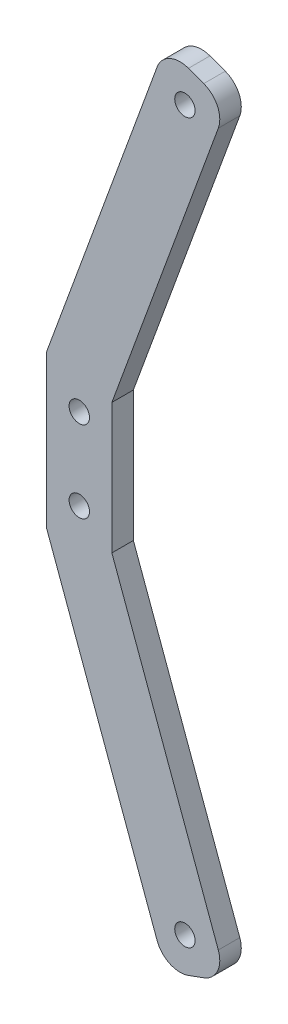
ISO-10303-21;
HEADER;
FILE_DESCRIPTION(('STEP AP214'),'2;1');
FILE_NAME('part.step','',(''),(''),'','','');
FILE_SCHEMA(('AUTOMOTIVE_DESIGN { 1 0 10303 214 1 1 1 1 }'));
ENDSEC;
DATA;
#1=APPLICATION_CONTEXT('core data for automotive mechanical design processes');
#2=APPLICATION_PROTOCOL_DEFINITION('international standard','automotive_design',2000,#1);
#3=PRODUCT_CONTEXT('',#1,'mechanical');
#4=PRODUCT('Part','Part','',(#3));
#5=PRODUCT_RELATED_PRODUCT_CATEGORY('part','',(#4));
#6=PRODUCT_DEFINITION_FORMATION('','',#4);
#7=PRODUCT_DEFINITION_CONTEXT('part definition',#1,'design');
#8=PRODUCT_DEFINITION('design','',#6,#7);
#9=PRODUCT_DEFINITION_SHAPE('','',#8);
#10=(LENGTH_UNIT() NAMED_UNIT(*) SI_UNIT(.MILLI.,.METRE.));
#11=(NAMED_UNIT(*) PLANE_ANGLE_UNIT() SI_UNIT($,.RADIAN.));
#12=(NAMED_UNIT(*) SI_UNIT($,.STERADIAN.) SOLID_ANGLE_UNIT());
#13=UNCERTAINTY_MEASURE_WITH_UNIT(LENGTH_MEASURE(1.E-05),#10,'distance_accuracy_value','');
#14=(GEOMETRIC_REPRESENTATION_CONTEXT(3) GLOBAL_UNCERTAINTY_ASSIGNED_CONTEXT((#13)) GLOBAL_UNIT_ASSIGNED_CONTEXT((#10,
#11,#12)) REPRESENTATION_CONTEXT('',''));
#15=CARTESIAN_POINT('',(0.,0.,0.));
#16=DIRECTION('',(0.,0.,1.));
#17=DIRECTION('',(1.,0.,0.));
#18=AXIS2_PLACEMENT_3D('',#15,#16,#17);
#19=CARTESIAN_POINT('',(0.,0.,8.382));
#20=DIRECTION('',(0.,0.,-1.));
#21=DIRECTION('',(-1.,0.,0.));
#22=AXIS2_PLACEMENT_3D('',#19,#20,#21);
#23=PLANE('',#22);
#24=CARTESIAN_POINT('',(12.7,15.875,8.382));
#25=DIRECTION('',(0.,0.,-1.));
#26=DIRECTION('',(-1.,0.,0.));
#27=AXIS2_PLACEMENT_3D('',#24,#25,#26);
#28=CIRCLE('',#27,3.96875);
#29=CARTESIAN_POINT('',(8.73125,15.875,8.382));
#30=VERTEX_POINT('',#29);
#31=EDGE_CURVE('E146',#30,#30,#28,.T.);
#32=ORIENTED_EDGE('',*,*,#31,.T.);
#33=EDGE_LOOP('',(#32));
#34=FACE_BOUND('',#33,.T.);
#35=CARTESIAN_POINT('',(53.8649414209173,140.079609063267,8.382));
#36=DIRECTION('',(0.,0.,-1.));
#37=DIRECTION('',(-1.,0.,0.));
#38=AXIS2_PLACEMENT_3D('',#35,#36,#37);
#39=CIRCLE('',#38,3.96874999999998);
#40=CARTESIAN_POINT('',(49.8961914209173,140.079609063267,8.382));
#41=VERTEX_POINT('',#40);
#42=EDGE_CURVE('E156',#41,#41,#39,.T.);
#43=ORIENTED_EDGE('',*,*,#42,.T.);
#44=EDGE_LOOP('',(#43));
#45=FACE_BOUND('',#44,.T.);
#46=DIRECTION('',(-0.939034257860021,-0.343823592217404,0.));
#47=VECTOR('',#46,1.);
#48=CARTESIAN_POINT('',(46.3057659672561,-156.37190375925,8.382));
#49=LINE('',#48,#47);
#50=CARTESIAN_POINT('',(61.2129348107839,-150.913704232799,8.382));
#51=VERTEX_POINT('',#50);
#52=CARTESIAN_POINT('',(55.2500672733727,-153.09698404338,8.382));
#53=VERTEX_POINT('',#52);
#54=EDGE_CURVE('E125',#51,#53,#49,.T.);
#55=ORIENTED_EDGE('',*,*,#54,.F.);
#56=CARTESIAN_POINT('',(57.9380150949131,-141.969402926682,8.382));
#57=DIRECTION('',(0.,0.,-1.));
#58=DIRECTION('',(-1.,0.,0.));
#59=AXIS2_PLACEMENT_3D('',#56,#57,#58);
#60=CIRCLE('',#59,9.525);
#61=CARTESIAN_POINT('',(66.8823164010298,-138.694483210812,8.382));
#62=VERTEX_POINT('',#61);
#63=EDGE_CURVE('E41',#51,#62,#60,.F.);
#64=ORIENTED_EDGE('',*,*,#63,.T.);
#65=DIRECTION('',(0.343823592217404,-0.939034257860021,0.));
#66=VECTOR('',#65,1.);
#67=CARTESIAN_POINT('',(70.1572361169006,-147.638784516928,8.382));
#68=LINE('',#67,#66);
#69=CARTESIAN_POINT('',(25.4,-25.4,8.382));
#70=VERTEX_POINT('',#69);
#71=EDGE_CURVE('E149',#70,#62,#68,.T.);
#72=ORIENTED_EDGE('',*,*,#71,.F.);
#73=DIRECTION('',(0.,1.,0.));
#74=VECTOR('',#73,1.);
#75=CARTESIAN_POINT('',(25.4,25.4,8.382));
#76=LINE('',#75,#74);
#77=CARTESIAN_POINT('',(25.4,25.4,8.382));
#78=VERTEX_POINT('',#77);
#79=EDGE_CURVE('E162',#70,#78,#76,.T.);
#80=ORIENTED_EDGE('',*,*,#79,.T.);
#81=DIRECTION('',(0.343823592217404,0.939034257860021,0.));
#82=VECTOR('',#81,1.);
#83=CARTESIAN_POINT('',(70.1572361169006,147.638784516928,8.382));
#84=LINE('',#83,#82);
#85=CARTESIAN_POINT('',(66.8823164010298,138.694483210812,8.382));
#86=VERTEX_POINT('',#85);
#87=EDGE_CURVE('E164',#78,#86,#84,.T.);
#88=ORIENTED_EDGE('',*,*,#87,.T.);
#89=CARTESIAN_POINT('',(57.9380150949131,141.969402926682,8.382));
#90=DIRECTION('',(0.,0.,-1.));
#91=DIRECTION('',(-1.,0.,0.));
#92=AXIS2_PLACEMENT_3D('',#89,#90,#91);
#93=CIRCLE('',#92,9.525);
#94=CARTESIAN_POINT('',(61.2129348107839,150.913704232799,8.382));
#95=VERTEX_POINT('',#94);
#96=EDGE_CURVE('E198',#86,#95,#93,.F.);
#97=ORIENTED_EDGE('',*,*,#96,.T.);
#98=DIRECTION('',(-0.939034257860021,0.343823592217404,0.));
#99=VECTOR('',#98,1.);
#100=CARTESIAN_POINT('',(46.3057659672561,156.37190375925,8.382));
#101=LINE('',#100,#99);
#102=CARTESIAN_POINT('',(55.2500672733727,153.09698404338,8.382));
#103=VERTEX_POINT('',#102);
#104=EDGE_CURVE('E167',#95,#103,#101,.T.);
#105=ORIENTED_EDGE('',*,*,#104,.T.);
#106=CARTESIAN_POINT('',(51.975147557502,144.152682737263,8.382));
#107=DIRECTION('',(0.,0.,-1.));
#108=DIRECTION('',(-1.,0.,0.));
#109=AXIS2_PLACEMENT_3D('',#106,#107,#108);
#110=CIRCLE('',#109,9.525);
#111=CARTESIAN_POINT('',(43.0308462513853,147.427602453134,8.382));
#112=VERTEX_POINT('',#111);
#113=EDGE_CURVE('E196',#103,#112,#110,.F.);
#114=ORIENTED_EDGE('',*,*,#113,.T.);
#115=DIRECTION('',(-0.343823592217404,-0.939034257860021,0.));
#116=VECTOR('',#115,1.);
#117=CARTESIAN_POINT('',(0.,29.9038498968864,8.382));
#118=LINE('',#117,#116);
#119=CARTESIAN_POINT('',(0.,29.9038498968864,8.382));
#120=VERTEX_POINT('',#119);
#121=EDGE_CURVE('E132',#112,#120,#118,.T.);
#122=ORIENTED_EDGE('',*,*,#121,.T.);
#123=DIRECTION('',(0.,-1.,0.));
#124=VECTOR('',#123,1.);
#125=CARTESIAN_POINT('',(0.,0.,8.382));
#126=LINE('',#125,#124);
#127=CARTESIAN_POINT('',(0.,-29.9038498968864,8.382));
#128=VERTEX_POINT('',#127);
#129=EDGE_CURVE('E129',#120,#128,#126,.T.);
#130=ORIENTED_EDGE('',*,*,#129,.T.);
#131=DIRECTION('',(-0.343823592217404,0.939034257860021,0.));
#132=VECTOR('',#131,1.);
#133=CARTESIAN_POINT('',(0.,-29.9038498968864,8.382));
#134=LINE('',#133,#132);
#135=CARTESIAN_POINT('',(43.0308462513853,-147.427602453134,8.382));
#136=VERTEX_POINT('',#135);
#137=EDGE_CURVE('E120',#136,#128,#134,.T.);
#138=ORIENTED_EDGE('',*,*,#137,.F.);
#139=CARTESIAN_POINT('',(51.975147557502,-144.152682737263,8.382));
#140=DIRECTION('',(0.,0.,-1.));
#141=DIRECTION('',(-1.,0.,0.));
#142=AXIS2_PLACEMENT_3D('',#139,#140,#141);
#143=CIRCLE('',#142,9.525);
#144=EDGE_CURVE('E53',#136,#53,#143,.F.);
#145=ORIENTED_EDGE('',*,*,#144,.T.);
#146=EDGE_LOOP('',(#55,#64,#72,#80,#88,#97,#105,#114,#122,#130,#138,#145));
#147=FACE_BOUND('',#146,.T.);
#148=CARTESIAN_POINT('',(53.8649414209173,-140.079609063267,8.382));
#149=DIRECTION('',(0.,0.,1.));
#150=DIRECTION('',(-1.,0.,0.));
#151=AXIS2_PLACEMENT_3D('',#148,#149,#150);
#152=CIRCLE('',#151,3.96874999999998);
#153=CARTESIAN_POINT('',(49.8961914209173,-140.079609063267,8.382));
#154=VERTEX_POINT('',#153);
#155=EDGE_CURVE('E239',#154,#154,#152,.T.);
#156=ORIENTED_EDGE('',*,*,#155,.F.);
#157=EDGE_LOOP('',(#156));
#158=FACE_BOUND('',#157,.T.);
#159=CARTESIAN_POINT('',(12.7,-15.875,8.382));
#160=DIRECTION('',(0.,0.,1.));
#161=DIRECTION('',(-1.,0.,0.));
#162=AXIS2_PLACEMENT_3D('',#159,#160,#161);
#163=CIRCLE('',#162,3.96875);
#164=CARTESIAN_POINT('',(8.73125,-15.875,8.382));
#165=VERTEX_POINT('',#164);
#166=EDGE_CURVE('E246',#165,#165,#163,.T.);
#167=ORIENTED_EDGE('',*,*,#166,.F.);
#168=EDGE_LOOP('',(#167));
#169=FACE_BOUND('',#168,.T.);
#170=ADVANCED_FACE('F33',(#34,#45,#147,#158,#169),#23,.F.);
#171=CARTESIAN_POINT('',(0.,0.,0.));
#172=DIRECTION('',(0.,0.,-1.));
#173=DIRECTION('',(-1.,0.,0.));
#174=AXIS2_PLACEMENT_3D('',#171,#172,#173);
#175=PLANE('',#174);
#176=CARTESIAN_POINT('',(53.8649414209173,-140.079609063267,0.));
#177=DIRECTION('',(0.,0.,1.));
#178=DIRECTION('',(-1.,0.,0.));
#179=AXIS2_PLACEMENT_3D('',#176,#177,#178);
#180=CIRCLE('',#179,3.96874999999998);
#181=CARTESIAN_POINT('',(49.8961914209173,-140.079609063267,0.));
#182=VERTEX_POINT('',#181);
#183=EDGE_CURVE('E243',#182,#182,#180,.T.);
#184=ORIENTED_EDGE('',*,*,#183,.T.);
#185=EDGE_LOOP('',(#184));
#186=FACE_BOUND('',#185,.T.);
#187=CARTESIAN_POINT('',(12.7,15.875,0.));
#188=DIRECTION('',(0.,0.,-1.));
#189=DIRECTION('',(-1.,0.,0.));
#190=AXIS2_PLACEMENT_3D('',#187,#188,#189);
#191=CIRCLE('',#190,3.96875);
#192=CARTESIAN_POINT('',(8.73125,15.875,0.));
#193=VERTEX_POINT('',#192);
#194=EDGE_CURVE('E142',#193,#193,#191,.T.);
#195=ORIENTED_EDGE('',*,*,#194,.F.);
#196=EDGE_LOOP('',(#195));
#197=FACE_BOUND('',#196,.T.);
#198=CARTESIAN_POINT('',(53.8649414209173,140.079609063267,0.));
#199=DIRECTION('',(0.,0.,-1.));
#200=DIRECTION('',(-1.,0.,0.));
#201=AXIS2_PLACEMENT_3D('',#198,#199,#200);
#202=CIRCLE('',#201,3.96874999999998);
#203=CARTESIAN_POINT('',(49.8961914209173,140.079609063267,0.));
#204=VERTEX_POINT('',#203);
#205=EDGE_CURVE('E154',#204,#204,#202,.T.);
#206=ORIENTED_EDGE('',*,*,#205,.F.);
#207=EDGE_LOOP('',(#206));
#208=FACE_BOUND('',#207,.T.);
#209=DIRECTION('',(0.343823592217404,-0.939034257860021,0.));
#210=VECTOR('',#209,1.);
#211=CARTESIAN_POINT('',(70.1572361169006,-147.638784516928,0.));
#212=LINE('',#211,#210);
#213=CARTESIAN_POINT('',(25.4,-25.4,0.));
#214=VERTEX_POINT('',#213);
#215=CARTESIAN_POINT('',(66.8823164010298,-138.694483210812,0.));
#216=VERTEX_POINT('',#215);
#217=EDGE_CURVE('E126',#214,#216,#212,.T.);
#218=ORIENTED_EDGE('',*,*,#217,.T.);
#219=CARTESIAN_POINT('',(57.9380150949131,-141.969402926682,0.));
#220=DIRECTION('',(0.,0.,-1.));
#221=DIRECTION('',(-1.,0.,0.));
#222=AXIS2_PLACEMENT_3D('',#219,#220,#221);
#223=CIRCLE('',#222,9.525);
#224=CARTESIAN_POINT('',(61.2129348107839,-150.913704232799,0.));
#225=VERTEX_POINT('',#224);
#226=EDGE_CURVE('E208',#216,#225,#223,.T.);
#227=ORIENTED_EDGE('',*,*,#226,.T.);
#228=DIRECTION('',(-0.939034257860021,-0.343823592217404,0.));
#229=VECTOR('',#228,1.);
#230=CARTESIAN_POINT('',(46.3057659672561,-156.37190375925,0.));
#231=LINE('',#230,#229);
#232=CARTESIAN_POINT('',(55.2500672733727,-153.09698404338,0.));
#233=VERTEX_POINT('',#232);
#234=EDGE_CURVE('E233',#225,#233,#231,.T.);
#235=ORIENTED_EDGE('',*,*,#234,.T.);
#236=CARTESIAN_POINT('',(51.975147557502,-144.152682737263,0.));
#237=DIRECTION('',(0.,0.,-1.));
#238=DIRECTION('',(-1.,0.,0.));
#239=AXIS2_PLACEMENT_3D('',#236,#237,#238);
#240=CIRCLE('',#239,9.525);
#241=CARTESIAN_POINT('',(43.0308462513853,-147.427602453134,0.));
#242=VERTEX_POINT('',#241);
#243=EDGE_CURVE('E206',#233,#242,#240,.T.);
#244=ORIENTED_EDGE('',*,*,#243,.T.);
#245=DIRECTION('',(-0.343823592217404,0.939034257860021,0.));
#246=VECTOR('',#245,1.);
#247=CARTESIAN_POINT('',(0.,-29.9038498968864,0.));
#248=LINE('',#247,#246);
#249=CARTESIAN_POINT('',(0.,-29.9038498968864,0.));
#250=VERTEX_POINT('',#249);
#251=EDGE_CURVE('E237',#242,#250,#248,.T.);
#252=ORIENTED_EDGE('',*,*,#251,.T.);
#253=DIRECTION('',(0.,-1.,0.));
#254=VECTOR('',#253,1.);
#255=CARTESIAN_POINT('',(0.,0.,0.));
#256=LINE('',#255,#254);
#257=CARTESIAN_POINT('',(0.,29.9038498968864,0.));
#258=VERTEX_POINT('',#257);
#259=EDGE_CURVE('E141',#258,#250,#256,.T.);
#260=ORIENTED_EDGE('',*,*,#259,.F.);
#261=DIRECTION('',(-0.343823592217404,-0.939034257860021,0.));
#262=VECTOR('',#261,1.);
#263=CARTESIAN_POINT('',(0.,29.9038498968864,0.));
#264=LINE('',#263,#262);
#265=CARTESIAN_POINT('',(43.0308462513853,147.427602453134,0.));
#266=VERTEX_POINT('',#265);
#267=EDGE_CURVE('E178',#266,#258,#264,.T.);
#268=ORIENTED_EDGE('',*,*,#267,.F.);
#269=CARTESIAN_POINT('',(51.975147557502,144.152682737263,0.));
#270=DIRECTION('',(0.,0.,-1.));
#271=DIRECTION('',(-1.,0.,0.));
#272=AXIS2_PLACEMENT_3D('',#269,#270,#271);
#273=CIRCLE('',#272,9.525);
#274=CARTESIAN_POINT('',(55.2500672733727,153.09698404338,0.));
#275=VERTEX_POINT('',#274);
#276=EDGE_CURVE('E190',#266,#275,#273,.T.);
#277=ORIENTED_EDGE('',*,*,#276,.T.);
#278=DIRECTION('',(-0.939034257860021,0.343823592217404,0.));
#279=VECTOR('',#278,1.);
#280=CARTESIAN_POINT('',(46.3057659672561,156.37190375925,0.));
#281=LINE('',#280,#279);
#282=CARTESIAN_POINT('',(61.2129348107839,150.913704232799,0.));
#283=VERTEX_POINT('',#282);
#284=EDGE_CURVE('E175',#283,#275,#281,.T.);
#285=ORIENTED_EDGE('',*,*,#284,.F.);
#286=CARTESIAN_POINT('',(57.9380150949131,141.969402926682,0.));
#287=DIRECTION('',(0.,0.,-1.));
#288=DIRECTION('',(-1.,0.,0.));
#289=AXIS2_PLACEMENT_3D('',#286,#287,#288);
#290=CIRCLE('',#289,9.525);
#291=CARTESIAN_POINT('',(66.8823164010298,138.694483210812,0.));
#292=VERTEX_POINT('',#291);
#293=EDGE_CURVE('E192',#283,#292,#290,.T.);
#294=ORIENTED_EDGE('',*,*,#293,.T.);
#295=DIRECTION('',(0.343823592217404,0.939034257860021,0.));
#296=VECTOR('',#295,1.);
#297=CARTESIAN_POINT('',(70.1572361169006,147.638784516928,0.));
#298=LINE('',#297,#296);
#299=CARTESIAN_POINT('',(25.4,25.4,0.));
#300=VERTEX_POINT('',#299);
#301=EDGE_CURVE('E172',#300,#292,#298,.T.);
#302=ORIENTED_EDGE('',*,*,#301,.F.);
#303=DIRECTION('',(0.,1.,0.));
#304=VECTOR('',#303,1.);
#305=CARTESIAN_POINT('',(25.4,25.4,0.));
#306=LINE('',#305,#304);
#307=EDGE_CURVE('E159',#214,#300,#306,.T.);
#308=ORIENTED_EDGE('',*,*,#307,.F.);
#309=EDGE_LOOP('',(#218,#227,#235,#244,#252,#260,#268,#277,#285,#294,#302,#308));
#310=FACE_BOUND('',#309,.T.);
#311=CARTESIAN_POINT('',(12.7,-15.875,0.));
#312=DIRECTION('',(0.,0.,1.));
#313=DIRECTION('',(-1.,0.,0.));
#314=AXIS2_PLACEMENT_3D('',#311,#312,#313);
#315=CIRCLE('',#314,3.96875);
#316=CARTESIAN_POINT('',(8.73125,-15.875,0.));
#317=VERTEX_POINT('',#316);
#318=EDGE_CURVE('E249',#317,#317,#315,.T.);
#319=ORIENTED_EDGE('',*,*,#318,.T.);
#320=EDGE_LOOP('',(#319));
#321=FACE_BOUND('',#320,.T.);
#322=ADVANCED_FACE('F231',(#186,#197,#208,#310,#321),#175,.T.);
#323=CARTESIAN_POINT('',(25.4,25.4,8.382));
#324=DIRECTION('',(-1.,0.,0.));
#325=DIRECTION('',(0.,-1.,0.));
#326=AXIS2_PLACEMENT_3D('',#323,#324,#325);
#327=PLANE('',#326);
#328=ORIENTED_EDGE('',*,*,#307,.T.);
#329=DIRECTION('',(0.,0.,-1.));
#330=VECTOR('',#329,1.);
#331=CARTESIAN_POINT('',(25.4,25.4,8.382));
#332=LINE('',#331,#330);
#333=EDGE_CURVE('E182',#78,#300,#332,.T.);
#334=ORIENTED_EDGE('',*,*,#333,.F.);
#335=ORIENTED_EDGE('',*,*,#79,.F.);
#336=DIRECTION('',(0.,0.,-1.));
#337=VECTOR('',#336,1.);
#338=CARTESIAN_POINT('',(25.4,-25.4,8.382));
#339=LINE('',#338,#337);
#340=EDGE_CURVE('E143',#70,#214,#339,.T.);
#341=ORIENTED_EDGE('',*,*,#340,.T.);
#342=EDGE_LOOP('',(#328,#334,#335,#341));
#343=FACE_BOUND('',#342,.T.);
#344=ADVANCED_FACE('F264',(#343),#327,.F.);
#345=CARTESIAN_POINT('',(70.1572361169006,147.638784516928,8.382));
#346=DIRECTION('',(-0.939034257860021,0.343823592217404,0.));
#347=DIRECTION('',(-0.343823592217404,-0.939034257860021,0.));
#348=AXIS2_PLACEMENT_3D('',#345,#346,#347);
#349=PLANE('',#348);
#350=ORIENTED_EDGE('',*,*,#301,.T.);
#351=DIRECTION('',(0.,0.,-1.));
#352=VECTOR('',#351,1.);
#353=CARTESIAN_POINT('',(66.8823164010298,138.694483210812,8.382));
#354=LINE('',#353,#352);
#355=EDGE_CURVE('E194',#292,#86,#354,.F.);
#356=ORIENTED_EDGE('',*,*,#355,.T.);
#357=ORIENTED_EDGE('',*,*,#87,.F.);
#358=ORIENTED_EDGE('',*,*,#333,.T.);
#359=EDGE_LOOP('',(#350,#356,#357,#358));
#360=FACE_BOUND('',#359,.T.);
#361=ADVANCED_FACE('F281',(#360),#349,.F.);
#362=CARTESIAN_POINT('',(46.3057659672561,156.37190375925,8.382));
#363=DIRECTION('',(-0.343823592217404,-0.939034257860021,0.));
#364=DIRECTION('',(0.939034257860021,-0.343823592217404,0.));
#365=AXIS2_PLACEMENT_3D('',#362,#363,#364);
#366=PLANE('',#365);
#367=ORIENTED_EDGE('',*,*,#104,.F.);
#368=DIRECTION('',(0.,0.,-1.));
#369=VECTOR('',#368,1.);
#370=CARTESIAN_POINT('',(61.2129348107839,150.913704232799,8.382));
#371=LINE('',#370,#369);
#372=EDGE_CURVE('E187',#95,#283,#371,.T.);
#373=ORIENTED_EDGE('',*,*,#372,.T.);
#374=ORIENTED_EDGE('',*,*,#284,.T.);
#375=DIRECTION('',(0.,0.,-1.));
#376=VECTOR('',#375,1.);
#377=CARTESIAN_POINT('',(55.2500672733727,153.09698404338,8.382));
#378=LINE('',#377,#376);
#379=EDGE_CURVE('E185',#275,#103,#378,.F.);
#380=ORIENTED_EDGE('',*,*,#379,.T.);
#381=EDGE_LOOP('',(#367,#373,#374,#380));
#382=FACE_BOUND('',#381,.T.);
#383=ADVANCED_FACE('F277',(#382),#366,.F.);
#384=CARTESIAN_POINT('',(0.,29.9038498968864,8.382));
#385=DIRECTION('',(0.939034257860021,-0.343823592217404,0.));
#386=DIRECTION('',(0.343823592217404,0.939034257860021,0.));
#387=AXIS2_PLACEMENT_3D('',#384,#385,#386);
#388=PLANE('',#387);
#389=ORIENTED_EDGE('',*,*,#121,.F.);
#390=DIRECTION('',(0.,0.,-1.));
#391=VECTOR('',#390,1.);
#392=CARTESIAN_POINT('',(43.0308462513853,147.427602453134,8.382));
#393=LINE('',#392,#391);
#394=EDGE_CURVE('E200',#112,#266,#393,.T.);
#395=ORIENTED_EDGE('',*,*,#394,.T.);
#396=ORIENTED_EDGE('',*,*,#267,.T.);
#397=DIRECTION('',(0.,0.,-1.));
#398=VECTOR('',#397,1.);
#399=CARTESIAN_POINT('',(0.,29.9038498968864,8.382));
#400=LINE('',#399,#398);
#401=EDGE_CURVE('E136',#120,#258,#400,.T.);
#402=ORIENTED_EDGE('',*,*,#401,.F.);
#403=EDGE_LOOP('',(#389,#395,#396,#402));
#404=FACE_BOUND('',#403,.T.);
#405=ADVANCED_FACE('F274',(#404),#388,.F.);
#406=CARTESIAN_POINT('',(0.,0.,8.382));
#407=DIRECTION('',(1.,0.,0.));
#408=DIRECTION('',(0.,0.,-1.));
#409=AXIS2_PLACEMENT_3D('',#406,#407,#408);
#410=PLANE('',#409);
#411=ORIENTED_EDGE('',*,*,#259,.T.);
#412=DIRECTION('',(0.,0.,-1.));
#413=VECTOR('',#412,1.);
#414=CARTESIAN_POINT('',(0.,-29.9038498968864,8.382));
#415=LINE('',#414,#413);
#416=EDGE_CURVE('E124',#128,#250,#415,.T.);
#417=ORIENTED_EDGE('',*,*,#416,.F.);
#418=ORIENTED_EDGE('',*,*,#129,.F.);
#419=ORIENTED_EDGE('',*,*,#401,.T.);
#420=EDGE_LOOP('',(#411,#417,#418,#419));
#421=FACE_BOUND('',#420,.T.);
#422=ADVANCED_FACE('F139',(#421),#410,.F.);
#423=CARTESIAN_POINT('',(53.8649414209173,140.079609063267,8.382));
#424=DIRECTION('',(0.,0.,-1.));
#425=DIRECTION('',(-1.,0.,0.));
#426=AXIS2_PLACEMENT_3D('',#423,#424,#425);
#427=CYLINDRICAL_SURFACE('',#426,3.96874999999998);
#428=ORIENTED_EDGE('',*,*,#42,.F.);
#429=EDGE_LOOP('',(#428));
#430=FACE_BOUND('',#429,.T.);
#431=ORIENTED_EDGE('',*,*,#205,.T.);
#432=EDGE_LOOP('',(#431));
#433=FACE_BOUND('',#432,.T.);
#434=ADVANCED_FACE('F269',(#430,#433),#427,.F.);
#435=CARTESIAN_POINT('',(12.7,15.875,8.382));
#436=DIRECTION('',(0.,0.,-1.));
#437=DIRECTION('',(-1.,0.,0.));
#438=AXIS2_PLACEMENT_3D('',#435,#436,#437);
#439=CYLINDRICAL_SURFACE('',#438,3.96875);
#440=ORIENTED_EDGE('',*,*,#31,.F.);
#441=EDGE_LOOP('',(#440));
#442=FACE_BOUND('',#441,.T.);
#443=ORIENTED_EDGE('',*,*,#194,.T.);
#444=EDGE_LOOP('',(#443));
#445=FACE_BOUND('',#444,.T.);
#446=ADVANCED_FACE('F293',(#442,#445),#439,.F.);
#447=CARTESIAN_POINT('',(57.9380150949131,141.969402926682,8.382));
#448=DIRECTION('',(0.,0.,-1.));
#449=DIRECTION('',(-1.,0.,0.));
#450=AXIS2_PLACEMENT_3D('',#447,#448,#449);
#451=CYLINDRICAL_SURFACE('',#450,9.525);
#452=ORIENTED_EDGE('',*,*,#96,.F.);
#453=ORIENTED_EDGE('',*,*,#355,.F.);
#454=ORIENTED_EDGE('',*,*,#293,.F.);
#455=ORIENTED_EDGE('',*,*,#372,.F.);
#456=EDGE_LOOP('',(#452,#453,#454,#455));
#457=FACE_BOUND('',#456,.T.);
#458=ADVANCED_FACE('F289',(#457),#451,.T.);
#459=CARTESIAN_POINT('',(51.975147557502,144.152682737263,8.382));
#460=DIRECTION('',(0.,0.,-1.));
#461=DIRECTION('',(-1.,0.,0.));
#462=AXIS2_PLACEMENT_3D('',#459,#460,#461);
#463=CYLINDRICAL_SURFACE('',#462,9.525);
#464=ORIENTED_EDGE('',*,*,#113,.F.);
#465=ORIENTED_EDGE('',*,*,#379,.F.);
#466=ORIENTED_EDGE('',*,*,#276,.F.);
#467=ORIENTED_EDGE('',*,*,#394,.F.);
#468=EDGE_LOOP('',(#464,#465,#466,#467));
#469=FACE_BOUND('',#468,.T.);
#470=ADVANCED_FACE('F292',(#469),#463,.T.);
#471=CARTESIAN_POINT('',(0.,-29.9038498968864,8.382));
#472=DIRECTION('',(-0.939034257860021,-0.343823592217404,0.));
#473=DIRECTION('',(0.343823592217404,-0.939034257860021,0.));
#474=AXIS2_PLACEMENT_3D('',#471,#472,#473);
#475=PLANE('',#474);
#476=ORIENTED_EDGE('',*,*,#251,.F.);
#477=DIRECTION('',(0.,0.,-1.));
#478=VECTOR('',#477,1.);
#479=CARTESIAN_POINT('',(43.0308462513853,-147.427602453134,8.382));
#480=LINE('',#479,#478);
#481=EDGE_CURVE('E11',#242,#136,#480,.F.);
#482=ORIENTED_EDGE('',*,*,#481,.T.);
#483=ORIENTED_EDGE('',*,*,#137,.T.);
#484=ORIENTED_EDGE('',*,*,#416,.T.);
#485=EDGE_LOOP('',(#476,#482,#483,#484));
#486=FACE_BOUND('',#485,.T.);
#487=ADVANCED_FACE('F122',(#486),#475,.T.);
#488=CARTESIAN_POINT('',(46.3057659672561,-156.37190375925,8.382));
#489=DIRECTION('',(0.343823592217404,-0.939034257860021,0.));
#490=DIRECTION('',(0.939034257860021,0.343823592217404,0.));
#491=AXIS2_PLACEMENT_3D('',#488,#489,#490);
#492=PLANE('',#491);
#493=ORIENTED_EDGE('',*,*,#234,.F.);
#494=DIRECTION('',(0.,0.,-1.));
#495=VECTOR('',#494,1.);
#496=CARTESIAN_POINT('',(61.2129348107839,-150.913704232799,8.382));
#497=LINE('',#496,#495);
#498=EDGE_CURVE('E213',#225,#51,#497,.F.);
#499=ORIENTED_EDGE('',*,*,#498,.T.);
#500=ORIENTED_EDGE('',*,*,#54,.T.);
#501=DIRECTION('',(0.,0.,-1.));
#502=VECTOR('',#501,1.);
#503=CARTESIAN_POINT('',(55.2500672733727,-153.09698404338,8.382));
#504=LINE('',#503,#502);
#505=EDGE_CURVE('E210',#53,#233,#504,.T.);
#506=ORIENTED_EDGE('',*,*,#505,.T.);
#507=EDGE_LOOP('',(#493,#499,#500,#506));
#508=FACE_BOUND('',#507,.T.);
#509=ADVANCED_FACE('F235',(#508),#492,.T.);
#510=CARTESIAN_POINT('',(70.1572361169006,-147.638784516928,8.382));
#511=DIRECTION('',(0.939034257860021,0.343823592217404,0.));
#512=DIRECTION('',(-0.343823592217404,0.939034257860021,0.));
#513=AXIS2_PLACEMENT_3D('',#510,#511,#512);
#514=PLANE('',#513);
#515=ORIENTED_EDGE('',*,*,#71,.T.);
#516=DIRECTION('',(0.,0.,-1.));
#517=VECTOR('',#516,1.);
#518=CARTESIAN_POINT('',(66.8823164010298,-138.694483210812,8.382));
#519=LINE('',#518,#517);
#520=EDGE_CURVE('E203',#62,#216,#519,.T.);
#521=ORIENTED_EDGE('',*,*,#520,.T.);
#522=ORIENTED_EDGE('',*,*,#217,.F.);
#523=ORIENTED_EDGE('',*,*,#340,.F.);
#524=EDGE_LOOP('',(#515,#521,#522,#523));
#525=FACE_BOUND('',#524,.T.);
#526=ADVANCED_FACE('F223',(#525),#514,.T.);
#527=CARTESIAN_POINT('',(53.8649414209173,-140.079609063267,8.382));
#528=DIRECTION('',(0.,0.,-1.));
#529=DIRECTION('',(-1.,0.,0.));
#530=AXIS2_PLACEMENT_3D('',#527,#528,#529);
#531=CYLINDRICAL_SURFACE('',#530,3.96874999999998);
#532=ORIENTED_EDGE('',*,*,#155,.T.);
#533=EDGE_LOOP('',(#532));
#534=FACE_BOUND('',#533,.T.);
#535=ORIENTED_EDGE('',*,*,#183,.F.);
#536=EDGE_LOOP('',(#535));
#537=FACE_BOUND('',#536,.T.);
#538=ADVANCED_FACE('F303',(#534,#537),#531,.F.);
#539=CARTESIAN_POINT('',(12.7,-15.875,8.382));
#540=DIRECTION('',(0.,0.,-1.));
#541=DIRECTION('',(-1.,0.,0.));
#542=AXIS2_PLACEMENT_3D('',#539,#540,#541);
#543=CYLINDRICAL_SURFACE('',#542,3.96875);
#544=ORIENTED_EDGE('',*,*,#166,.T.);
#545=EDGE_LOOP('',(#544));
#546=FACE_BOUND('',#545,.T.);
#547=ORIENTED_EDGE('',*,*,#318,.F.);
#548=EDGE_LOOP('',(#547));
#549=FACE_BOUND('',#548,.T.);
#550=ADVANCED_FACE('F255',(#546,#549),#543,.F.);
#551=CARTESIAN_POINT('',(57.9380150949131,-141.969402926682,8.382));
#552=DIRECTION('',(0.,0.,-1.));
#553=DIRECTION('',(-1.,0.,0.));
#554=AXIS2_PLACEMENT_3D('',#551,#552,#553);
#555=CYLINDRICAL_SURFACE('',#554,9.525);
#556=ORIENTED_EDGE('',*,*,#63,.F.);
#557=ORIENTED_EDGE('',*,*,#498,.F.);
#558=ORIENTED_EDGE('',*,*,#226,.F.);
#559=ORIENTED_EDGE('',*,*,#520,.F.);
#560=EDGE_LOOP('',(#556,#557,#558,#559));
#561=FACE_BOUND('',#560,.T.);
#562=ADVANCED_FACE('F227',(#561),#555,.T.);
#563=CARTESIAN_POINT('',(51.975147557502,-144.152682737263,8.382));
#564=DIRECTION('',(0.,0.,-1.));
#565=DIRECTION('',(-1.,0.,0.));
#566=AXIS2_PLACEMENT_3D('',#563,#564,#565);
#567=CYLINDRICAL_SURFACE('',#566,9.525);
#568=ORIENTED_EDGE('',*,*,#144,.F.);
#569=ORIENTED_EDGE('',*,*,#481,.F.);
#570=ORIENTED_EDGE('',*,*,#243,.F.);
#571=ORIENTED_EDGE('',*,*,#505,.F.);
#572=EDGE_LOOP('',(#568,#569,#570,#571));
#573=FACE_BOUND('',#572,.T.);
#574=ADVANCED_FACE('F35',(#573),#567,.T.);
#575=CLOSED_SHELL('',(#170,#322,#344,#361,#383,#405,#422,#434,#446,#458,#470,#487,#509,#526,
#538,#550,#562,#574));
#576=MANIFOLD_SOLID_BREP('B2',#575);
#577=ADVANCED_BREP_SHAPE_REPRESENTATION('',(#18,#576),#14);
#578=SHAPE_DEFINITION_REPRESENTATION(#9,#577);
ENDSEC;
END-ISO-10303-21;
